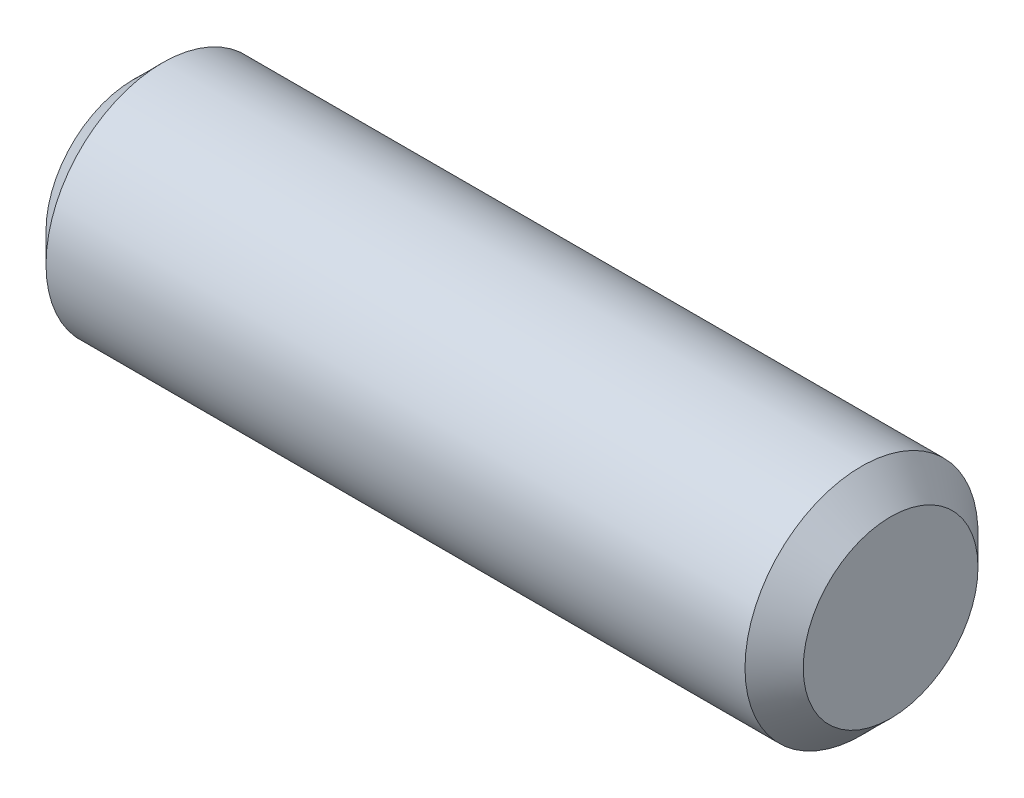
ISO-10303-21;
HEADER;
FILE_DESCRIPTION(('STEP AP214'),'2;1');
FILE_NAME('part.step','',(''),(''),'','','');
FILE_SCHEMA(('AUTOMOTIVE_DESIGN { 1 0 10303 214 1 1 1 1 }'));
ENDSEC;
DATA;
#1=APPLICATION_CONTEXT('core data for automotive mechanical design processes');
#2=APPLICATION_PROTOCOL_DEFINITION('international standard','automotive_design',2000,#1);
#3=PRODUCT_CONTEXT('',#1,'mechanical');
#4=PRODUCT('Part','Part','',(#3));
#5=PRODUCT_RELATED_PRODUCT_CATEGORY('part','',(#4));
#6=PRODUCT_DEFINITION_FORMATION('','',#4);
#7=PRODUCT_DEFINITION_CONTEXT('part definition',#1,'design');
#8=PRODUCT_DEFINITION('design','',#6,#7);
#9=PRODUCT_DEFINITION_SHAPE('','',#8);
#10=(LENGTH_UNIT() NAMED_UNIT(*) SI_UNIT(.MILLI.,.METRE.));
#11=(NAMED_UNIT(*) PLANE_ANGLE_UNIT() SI_UNIT($,.RADIAN.));
#12=(NAMED_UNIT(*) SI_UNIT($,.STERADIAN.) SOLID_ANGLE_UNIT());
#13=UNCERTAINTY_MEASURE_WITH_UNIT(LENGTH_MEASURE(1.E-05),#10,'distance_accuracy_value','');
#14=(GEOMETRIC_REPRESENTATION_CONTEXT(3) GLOBAL_UNCERTAINTY_ASSIGNED_CONTEXT((#13)) GLOBAL_UNIT_ASSIGNED_CONTEXT((#10,
#11,#12)) REPRESENTATION_CONTEXT('',''));
#15=CARTESIAN_POINT('',(0.,0.,0.));
#16=DIRECTION('',(0.,0.,1.));
#17=DIRECTION('',(1.,0.,0.));
#18=AXIS2_PLACEMENT_3D('',#15,#16,#17);
#19=CARTESIAN_POINT('',(9.75,0.,0.));
#20=DIRECTION('',(-1.,0.,0.));
#21=DIRECTION('',(0.,0.,1.));
#22=AXIS2_PLACEMENT_3D('',#19,#20,#21);
#23=CYLINDRICAL_SURFACE('',#22,1.);
#24=CARTESIAN_POINT('',(9.50000000000001,0.,0.));
#25=DIRECTION('',(1.,0.,0.));
#26=DIRECTION('',(0.,0.,-1.));
#27=AXIS2_PLACEMENT_3D('',#24,#25,#26);
#28=CIRCLE('',#27,1.);
#29=CARTESIAN_POINT('',(9.5,0.,1.));
#30=VERTEX_POINT('',#29);
#31=EDGE_CURVE('E42',#30,#30,#28,.F.);
#32=CARTESIAN_POINT('',(3.50000000000001,0.,0.));
#33=DIRECTION('',(1.,0.,0.));
#34=DIRECTION('',(0.,0.,-1.));
#35=AXIS2_PLACEMENT_3D('',#32,#33,#34);
#36=CIRCLE('',#35,1.);
#37=CARTESIAN_POINT('',(3.50000000000001,0.,1.));
#38=VERTEX_POINT('',#37);
#39=EDGE_CURVE('E46',#38,#38,#36,.T.);
#40=CARTESIAN_POINT('',(9.5,0.,1.));
#41=CARTESIAN_POINT('',(9.4375,0.,1.));
#42=CARTESIAN_POINT('',(9.37500000000001,0.,1.));
#43=CARTESIAN_POINT('',(9.25000000000001,0.,1.));
#44=CARTESIAN_POINT('',(9.18750000000001,0.,1.));
#45=CARTESIAN_POINT('',(9.06250000000001,0.,1.));
#46=CARTESIAN_POINT('',(9.00000000000001,0.,1.));
#47=CARTESIAN_POINT('',(8.875,0.,1.));
#48=CARTESIAN_POINT('',(8.8125,0.,1.));
#49=CARTESIAN_POINT('',(8.6875,0.,1.));
#50=CARTESIAN_POINT('',(8.625,0.,1.));
#51=CARTESIAN_POINT('',(8.5,0.,1.));
#52=CARTESIAN_POINT('',(8.43750000000001,0.,1.));
#53=CARTESIAN_POINT('',(8.31250000000001,0.,1.));
#54=CARTESIAN_POINT('',(8.25000000000001,0.,1.));
#55=CARTESIAN_POINT('',(8.12500000000001,0.,1.));
#56=CARTESIAN_POINT('',(8.06250000000001,0.,1.));
#57=CARTESIAN_POINT('',(7.93750000000001,0.,1.));
#58=CARTESIAN_POINT('',(7.87500000000001,0.,1.));
#59=CARTESIAN_POINT('',(7.75000000000001,0.,1.));
#60=CARTESIAN_POINT('',(7.68750000000001,0.,1.));
#61=CARTESIAN_POINT('',(7.56250000000001,0.,1.));
#62=CARTESIAN_POINT('',(7.50000000000001,0.,1.));
#63=CARTESIAN_POINT('',(7.37500000000001,0.,1.));
#64=CARTESIAN_POINT('',(7.31250000000001,0.,1.));
#65=CARTESIAN_POINT('',(7.18750000000001,0.,1.));
#66=CARTESIAN_POINT('',(7.12500000000001,0.,1.));
#67=CARTESIAN_POINT('',(7.00000000000001,0.,1.));
#68=CARTESIAN_POINT('',(6.93750000000001,0.,1.));
#69=CARTESIAN_POINT('',(6.81250000000001,0.,1.));
#70=CARTESIAN_POINT('',(6.75000000000001,0.,1.));
#71=CARTESIAN_POINT('',(6.62500000000001,0.,1.));
#72=CARTESIAN_POINT('',(6.56250000000001,0.,1.));
#73=CARTESIAN_POINT('',(6.43750000000001,0.,1.));
#74=CARTESIAN_POINT('',(6.37500000000001,0.,1.));
#75=CARTESIAN_POINT('',(6.25000000000001,0.,1.));
#76=CARTESIAN_POINT('',(6.18750000000001,0.,1.));
#77=CARTESIAN_POINT('',(6.06250000000001,0.,1.));
#78=CARTESIAN_POINT('',(6.00000000000001,0.,1.));
#79=CARTESIAN_POINT('',(5.87500000000001,0.,1.));
#80=CARTESIAN_POINT('',(5.81250000000001,0.,1.));
#81=CARTESIAN_POINT('',(5.68750000000001,0.,1.));
#82=CARTESIAN_POINT('',(5.62500000000001,0.,1.));
#83=CARTESIAN_POINT('',(5.50000000000001,0.,1.));
#84=CARTESIAN_POINT('',(5.43750000000001,0.,1.));
#85=CARTESIAN_POINT('',(5.31250000000001,0.,1.));
#86=CARTESIAN_POINT('',(5.25000000000001,0.,1.));
#87=CARTESIAN_POINT('',(5.12500000000001,0.,1.));
#88=CARTESIAN_POINT('',(5.06250000000001,0.,1.));
#89=CARTESIAN_POINT('',(4.93750000000001,0.,1.));
#90=CARTESIAN_POINT('',(4.87500000000001,0.,1.));
#91=CARTESIAN_POINT('',(4.75000000000001,0.,1.));
#92=CARTESIAN_POINT('',(4.68750000000001,0.,1.));
#93=CARTESIAN_POINT('',(4.56250000000001,0.,1.));
#94=CARTESIAN_POINT('',(4.50000000000001,0.,1.));
#95=CARTESIAN_POINT('',(4.37500000000001,0.,1.));
#96=CARTESIAN_POINT('',(4.31250000000001,0.,1.));
#97=CARTESIAN_POINT('',(4.18750000000001,0.,1.));
#98=CARTESIAN_POINT('',(4.12500000000001,0.,1.));
#99=CARTESIAN_POINT('',(4.00000000000001,0.,1.));
#100=CARTESIAN_POINT('',(3.93750000000001,0.,1.));
#101=CARTESIAN_POINT('',(3.81250000000001,0.,1.));
#102=CARTESIAN_POINT('',(3.75000000000001,0.,1.));
#103=CARTESIAN_POINT('',(3.62500000000001,0.,1.));
#104=CARTESIAN_POINT('',(3.56250000000001,0.,1.));
#105=CARTESIAN_POINT('',(3.50000000000001,0.,1.));
#106=B_SPLINE_CURVE_WITH_KNOTS('',3,(#40,#41,#42,#43,#44,#45,#46,#47,#48,#49,#50,#51,#52,#53,
#54,#55,#56,#57,#58,#59,#60,#61,#62,#63,#64,#65,#66,#67,#68,#69,#70,#71,#72,#73,#74,#75,#76,#77,
#78,#79,#80,#81,#82,#83,#84,#85,#86,#87,#88,#89,#90,#91,#92,#93,#94,#95,#96,#97,#98,#99,#100,
#101,#102,#103,#104,#105),.UNSPECIFIED.,.F.,.F.,(4,2,2,2,2,2,2,2,2,2,2,2,2,2,2,2,2,2,2,2,2,2,2,
2,2,2,2,2,2,2,2,2,4),(0.,0.187499999999998,0.374999999999999,0.562499999999999,
0.749999999999999,0.937499999999999,1.125,1.3125,1.5,1.6875,1.875,2.0625,2.25,2.4375,2.625,
2.8125,3.,3.1875,3.375,3.5625,3.75,3.9375,4.12499999999999,4.3125,4.5,4.68749999999999,
4.87499999999999,5.06249999999999,5.24999999999999,5.43749999999999,5.62499999999999,
5.81249999999999,5.99999999999999),.UNSPECIFIED.);
#107=EDGE_CURVE('BSEAM35',#30,#38,#106,.T.);
#108=ORIENTED_EDGE('',*,*,#31,.T.);
#109=ORIENTED_EDGE('',*,*,#39,.T.);
#110=ORIENTED_EDGE('',*,*,#107,.T.);
#111=ORIENTED_EDGE('',*,*,#107,.F.);
#112=EDGE_LOOP('',(#108,#110,#109,#111));
#113=FACE_BOUND('',#112,.T.);
#114=ADVANCED_FACE('F35',(#113),#23,.T.);
#115=CARTESIAN_POINT('',(9.75,0.,0.));
#116=DIRECTION('',(1.,0.,0.));
#117=DIRECTION('',(0.,0.,-1.));
#118=AXIS2_PLACEMENT_3D('',#115,#116,#117);
#119=PLANE('',#118);
#120=CARTESIAN_POINT('',(9.75,0.,0.));
#121=DIRECTION('',(1.,0.,0.));
#122=DIRECTION('',(0.,0.,-1.));
#123=AXIS2_PLACEMENT_3D('',#120,#121,#122);
#124=CIRCLE('',#123,0.750000000000003);
#125=CARTESIAN_POINT('',(9.75,0.,-0.750000000000003));
#126=VERTEX_POINT('',#125);
#127=EDGE_CURVE('E50',#126,#126,#124,.T.);
#128=ORIENTED_EDGE('',*,*,#127,.T.);
#129=EDGE_LOOP('',(#128));
#130=FACE_BOUND('',#129,.T.);
#131=ADVANCED_FACE('F56',(#130),#119,.T.);
#132=CARTESIAN_POINT('',(3.25,0.,0.));
#133=DIRECTION('',(1.,0.,0.));
#134=DIRECTION('',(0.,0.,-1.));
#135=AXIS2_PLACEMENT_3D('',#132,#133,#134);
#136=PLANE('',#135);
#137=CARTESIAN_POINT('',(3.25,0.,0.));
#138=DIRECTION('',(1.,0.,0.));
#139=DIRECTION('',(0.,0.,-1.));
#140=AXIS2_PLACEMENT_3D('',#137,#138,#139);
#141=CIRCLE('',#140,0.749999999999992);
#142=CARTESIAN_POINT('',(3.25,0.,-0.749999999999992));
#143=VERTEX_POINT('',#142);
#144=EDGE_CURVE('E10',#143,#143,#141,.F.);
#145=ORIENTED_EDGE('',*,*,#144,.T.);
#146=EDGE_LOOP('',(#145));
#147=FACE_BOUND('',#146,.T.);
#148=ADVANCED_FACE('F60',(#147),#136,.F.);
#149=CARTESIAN_POINT('',(9.75,0.,0.));
#150=DIRECTION('',(-1.,0.,0.));
#151=DIRECTION('',(0.,0.,1.));
#152=AXIS2_PLACEMENT_3D('',#149,#150,#151);
#153=CONICAL_SURFACE('',#152,0.750000000000003,0.785398163397447);
#154=ORIENTED_EDGE('',*,*,#31,.F.);
#155=EDGE_LOOP('',(#154));
#156=FACE_BOUND('',#155,.T.);
#157=ORIENTED_EDGE('',*,*,#127,.F.);
#158=EDGE_LOOP('',(#157));
#159=FACE_BOUND('',#158,.T.);
#160=ADVANCED_FACE('F58',(#156,#159),#153,.T.);
#161=CARTESIAN_POINT('',(3.50000000000001,0.,0.));
#162=DIRECTION('',(1.,0.,0.));
#163=DIRECTION('',(0.,0.,-1.));
#164=AXIS2_PLACEMENT_3D('',#161,#162,#163);
#165=CONICAL_SURFACE('',#164,1.,0.78539816339745);
#166=ORIENTED_EDGE('',*,*,#144,.F.);
#167=EDGE_LOOP('',(#166));
#168=FACE_BOUND('',#167,.T.);
#169=ORIENTED_EDGE('',*,*,#39,.F.);
#170=EDGE_LOOP('',(#169));
#171=FACE_BOUND('',#170,.T.);
#172=ADVANCED_FACE('F37',(#168,#171),#165,.T.);
#173=CLOSED_SHELL('',(#114,#131,#148,#160,#172));
#174=MANIFOLD_SOLID_BREP('B2',#173);
#175=ADVANCED_BREP_SHAPE_REPRESENTATION('',(#18,#174),#14);
#176=SHAPE_DEFINITION_REPRESENTATION(#9,#175);
ENDSEC;
END-ISO-10303-21;
